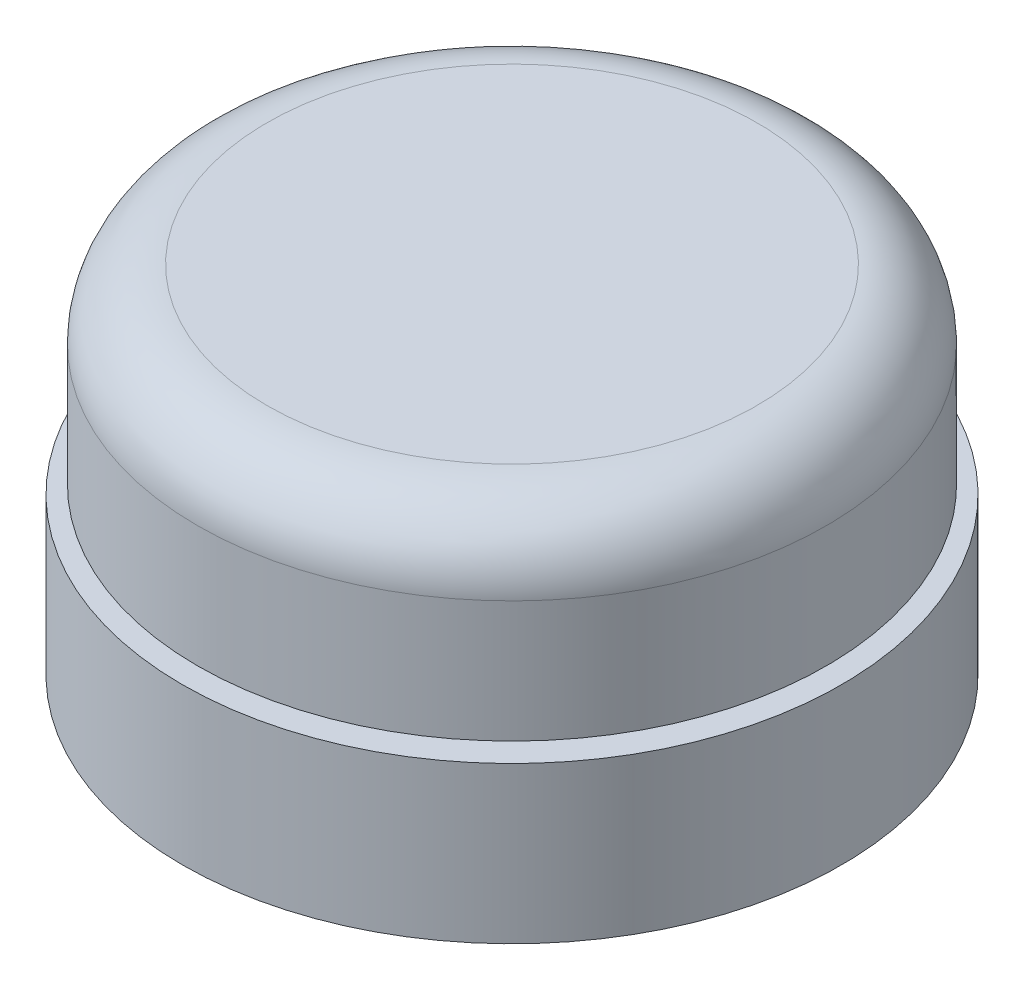
ISO-10303-21;
HEADER;
FILE_DESCRIPTION(('STEP AP214'),'2;1');
FILE_NAME('part.step','',(''),(''),'','','');
FILE_SCHEMA(('AUTOMOTIVE_DESIGN { 1 0 10303 214 1 1 1 1 }'));
ENDSEC;
DATA;
#1=APPLICATION_CONTEXT('core data for automotive mechanical design processes');
#2=APPLICATION_PROTOCOL_DEFINITION('international standard','automotive_design',2000,#1);
#3=PRODUCT_CONTEXT('',#1,'mechanical');
#4=PRODUCT('Part','Part','',(#3));
#5=PRODUCT_RELATED_PRODUCT_CATEGORY('part','',(#4));
#6=PRODUCT_DEFINITION_FORMATION('','',#4);
#7=PRODUCT_DEFINITION_CONTEXT('part definition',#1,'design');
#8=PRODUCT_DEFINITION('design','',#6,#7);
#9=PRODUCT_DEFINITION_SHAPE('','',#8);
#10=(LENGTH_UNIT() NAMED_UNIT(*) SI_UNIT(.MILLI.,.METRE.));
#11=(NAMED_UNIT(*) PLANE_ANGLE_UNIT() SI_UNIT($,.RADIAN.));
#12=(NAMED_UNIT(*) SI_UNIT($,.STERADIAN.) SOLID_ANGLE_UNIT());
#13=UNCERTAINTY_MEASURE_WITH_UNIT(LENGTH_MEASURE(1.E-05),#10,'distance_accuracy_value','');
#14=(GEOMETRIC_REPRESENTATION_CONTEXT(3) GLOBAL_UNCERTAINTY_ASSIGNED_CONTEXT((#13)) GLOBAL_UNIT_ASSIGNED_CONTEXT((#10,
#11,#12)) REPRESENTATION_CONTEXT('',''));
#15=CARTESIAN_POINT('',(0.,0.,0.));
#16=DIRECTION('',(0.,0.,1.));
#17=DIRECTION('',(1.,0.,0.));
#18=AXIS2_PLACEMENT_3D('',#15,#16,#17);
#19=CARTESIAN_POINT('',(0.,18.,0.));
#20=DIRECTION('',(0.,-1.,0.));
#21=DIRECTION('',(0.,0.,-1.));
#22=AXIS2_PLACEMENT_3D('',#19,#20,#21);
#23=CYLINDRICAL_SURFACE('',#22,38.);
#24=CARTESIAN_POINT('',(0.,18.,0.));
#25=DIRECTION('',(0.,1.,0.));
#26=DIRECTION('',(0.,0.,1.));
#27=AXIS2_PLACEMENT_3D('',#24,#25,#26);
#28=CIRCLE('',#27,38.);
#29=CARTESIAN_POINT('',(0.,18.,38.));
#30=VERTEX_POINT('',#29);
#31=EDGE_CURVE('E199',#30,#30,#28,.T.);
#32=ORIENTED_EDGE('',*,*,#31,.F.);
#33=EDGE_LOOP('',(#32));
#34=FACE_BOUND('',#33,.T.);
#35=CARTESIAN_POINT('',(0.,0.,0.));
#36=DIRECTION('',(0.,1.,0.));
#37=DIRECTION('',(0.,0.,1.));
#38=AXIS2_PLACEMENT_3D('',#35,#36,#37);
#39=CIRCLE('',#38,38.);
#40=CARTESIAN_POINT('',(0.,0.,38.));
#41=VERTEX_POINT('',#40);
#42=EDGE_CURVE('E193',#41,#41,#39,.T.);
#43=ORIENTED_EDGE('',*,*,#42,.T.);
#44=EDGE_LOOP('',(#43));
#45=FACE_BOUND('',#44,.T.);
#46=ADVANCED_FACE('F38',(#34,#45),#23,.T.);
#47=CARTESIAN_POINT('',(0.,18.,0.));
#48=DIRECTION('',(0.,1.,0.));
#49=DIRECTION('',(0.,0.,1.));
#50=AXIS2_PLACEMENT_3D('',#47,#48,#49);
#51=PLANE('',#50);
#52=CARTESIAN_POINT('',(0.,18.,0.));
#53=DIRECTION('',(0.,1.,0.));
#54=DIRECTION('',(0.,0.,1.));
#55=AXIS2_PLACEMENT_3D('',#52,#53,#54);
#56=CIRCLE('',#55,28.672717561261);
#57=CARTESIAN_POINT('',(0.,18.,28.672717561261));
#58=VERTEX_POINT('',#57);
#59=EDGE_CURVE('E194',#58,#58,#56,.T.);
#60=ORIENTED_EDGE('',*,*,#59,.F.);
#61=EDGE_LOOP('',(#60));
#62=FACE_BOUND('',#61,.T.);
#63=ORIENTED_EDGE('',*,*,#31,.T.);
#64=EDGE_LOOP('',(#63));
#65=FACE_BOUND('',#64,.T.);
#66=ADVANCED_FACE('F237',(#62,#65),#51,.T.);
#67=CARTESIAN_POINT('',(0.,0.,0.));
#68=DIRECTION('',(0.,1.,0.));
#69=DIRECTION('',(0.,0.,1.));
#70=AXIS2_PLACEMENT_3D('',#67,#68,#69);
#71=PLANE('',#70);
#72=CARTESIAN_POINT('',(-34.5,0.,0.));
#73=DIRECTION('',(0.,-1.,0.));
#74=DIRECTION('',(0.,0.,-1.));
#75=AXIS2_PLACEMENT_3D('',#72,#73,#74);
#76=CIRCLE('',#75,1.5);
#77=CARTESIAN_POINT('',(-34.5,0.,-1.5));
#78=VERTEX_POINT('',#77);
#79=EDGE_CURVE('E151',#78,#78,#76,.T.);
#80=ORIENTED_EDGE('',*,*,#79,.F.);
#81=EDGE_LOOP('',(#80));
#82=FACE_BOUND('',#81,.T.);
#83=CARTESIAN_POINT('',(-20.8596500450028,0.,20.8596500450035));
#84=DIRECTION('',(0.,-1.,0.));
#85=DIRECTION('',(0.,0.,-1.));
#86=AXIS2_PLACEMENT_3D('',#83,#84,#85);
#87=CIRCLE('',#86,1.5);
#88=CARTESIAN_POINT('',(-20.8596500450028,0.,19.3596500450035));
#89=VERTEX_POINT('',#88);
#90=EDGE_CURVE('E159',#89,#89,#87,.T.);
#91=ORIENTED_EDGE('',*,*,#90,.F.);
#92=EDGE_LOOP('',(#91));
#93=FACE_BOUND('',#92,.T.);
#94=CARTESIAN_POINT('',(1.07405111177578E-13,0.,29.5));
#95=DIRECTION('',(0.,-1.,0.));
#96=DIRECTION('',(0.,0.,-1.));
#97=AXIS2_PLACEMENT_3D('',#94,#95,#96);
#98=CIRCLE('',#97,1.5);
#99=CARTESIAN_POINT('',(1.07405111177578E-13,0.,28.));
#100=VERTEX_POINT('',#99);
#101=EDGE_CURVE('E167',#100,#100,#98,.T.);
#102=ORIENTED_EDGE('',*,*,#101,.F.);
#103=EDGE_LOOP('',(#102));
#104=FACE_BOUND('',#103,.T.);
#105=CARTESIAN_POINT('',(20.8596500450033,0.,20.859650045003));
#106=DIRECTION('',(0.,-1.,0.));
#107=DIRECTION('',(0.,0.,-1.));
#108=AXIS2_PLACEMENT_3D('',#105,#106,#107);
#109=CIRCLE('',#108,1.5);
#110=CARTESIAN_POINT('',(20.8596500450033,0.,19.359650045003));
#111=VERTEX_POINT('',#110);
#112=EDGE_CURVE('E118',#111,#111,#109,.T.);
#113=ORIENTED_EDGE('',*,*,#112,.F.);
#114=EDGE_LOOP('',(#113));
#115=FACE_BOUND('',#114,.T.);
#116=CARTESIAN_POINT('',(29.5,0.,-2.03059791203941E-13));
#117=DIRECTION('',(0.,-1.,0.));
#118=DIRECTION('',(0.,0.,-1.));
#119=AXIS2_PLACEMENT_3D('',#116,#117,#118);
#120=CIRCLE('',#119,1.5);
#121=CARTESIAN_POINT('',(29.5,0.,-1.5000000000002));
#122=VERTEX_POINT('',#121);
#123=EDGE_CURVE('E119',#122,#122,#120,.T.);
#124=ORIENTED_EDGE('',*,*,#123,.F.);
#125=EDGE_LOOP('',(#124));
#126=FACE_BOUND('',#125,.T.);
#127=CARTESIAN_POINT('',(20.859650045003,0.,-20.8596500450033));
#128=DIRECTION('',(0.,-1.,0.));
#129=DIRECTION('',(0.,0.,-1.));
#130=AXIS2_PLACEMENT_3D('',#127,#128,#129);
#131=CIRCLE('',#130,1.5);
#132=CARTESIAN_POINT('',(20.859650045003,0.,-22.3596500450033));
#133=VERTEX_POINT('',#132);
#134=EDGE_CURVE('E127',#133,#133,#131,.T.);
#135=ORIENTED_EDGE('',*,*,#134,.F.);
#136=EDGE_LOOP('',(#135));
#137=FACE_BOUND('',#136,.T.);
#138=CARTESIAN_POINT('',(-3.04589686805912E-13,0.,-29.5));
#139=DIRECTION('',(0.,-1.,0.));
#140=DIRECTION('',(0.,0.,-1.));
#141=AXIS2_PLACEMENT_3D('',#138,#139,#140);
#142=CIRCLE('',#141,1.5);
#143=CARTESIAN_POINT('',(-3.04589686805912E-13,0.,-31.));
#144=VERTEX_POINT('',#143);
#145=EDGE_CURVE('E135',#144,#144,#142,.T.);
#146=ORIENTED_EDGE('',*,*,#145,.F.);
#147=EDGE_LOOP('',(#146));
#148=FACE_BOUND('',#147,.T.);
#149=CARTESIAN_POINT('',(-20.8596500450034,0.,-20.8596500450029));
#150=DIRECTION('',(0.,-1.,0.));
#151=DIRECTION('',(0.,0.,-1.));
#152=AXIS2_PLACEMENT_3D('',#149,#150,#151);
#153=CIRCLE('',#152,1.5);
#154=CARTESIAN_POINT('',(-20.8596500450034,0.,-22.3596500450029));
#155=VERTEX_POINT('',#154);
#156=EDGE_CURVE('E108',#155,#155,#153,.T.);
#157=ORIENTED_EDGE('',*,*,#156,.F.);
#158=EDGE_LOOP('',(#157));
#159=FACE_BOUND('',#158,.T.);
#160=CARTESIAN_POINT('',(-29.5,0.,0.));
#161=DIRECTION('',(0.,-1.,0.));
#162=DIRECTION('',(0.,0.,-1.));
#163=AXIS2_PLACEMENT_3D('',#160,#161,#162);
#164=CIRCLE('',#163,1.5);
#165=CARTESIAN_POINT('',(-29.5,0.,-1.5));
#166=VERTEX_POINT('',#165);
#167=EDGE_CURVE('E150',#166,#166,#164,.T.);
#168=ORIENTED_EDGE('',*,*,#167,.F.);
#169=EDGE_LOOP('',(#168));
#170=FACE_BOUND('',#169,.T.);
#171=ORIENTED_EDGE('',*,*,#42,.F.);
#172=EDGE_LOOP('',(#171));
#173=FACE_BOUND('',#172,.T.);
#174=ADVANCED_FACE('F242',(#82,#93,#104,#115,#126,#137,#148,#159,#170,#173),#71,.F.);
#175=CARTESIAN_POINT('',(0.,19.,0.));
#176=DIRECTION('',(0.,-1.,0.));
#177=DIRECTION('',(0.,0.,-1.));
#178=AXIS2_PLACEMENT_3D('',#175,#176,#177);
#179=CYLINDRICAL_SURFACE('',#178,28.672717561261);
#180=CARTESIAN_POINT('',(0.,19.,0.));
#181=DIRECTION('',(0.,1.,0.));
#182=DIRECTION('',(0.,0.,1.));
#183=AXIS2_PLACEMENT_3D('',#180,#181,#182);
#184=CIRCLE('',#183,28.672717561261);
#185=CARTESIAN_POINT('',(0.,19.,28.672717561261));
#186=VERTEX_POINT('',#185);
#187=EDGE_CURVE('E189',#186,#186,#184,.T.);
#188=ORIENTED_EDGE('',*,*,#187,.F.);
#189=EDGE_LOOP('',(#188));
#190=FACE_BOUND('',#189,.T.);
#191=ORIENTED_EDGE('',*,*,#59,.T.);
#192=EDGE_LOOP('',(#191));
#193=FACE_BOUND('',#192,.T.);
#194=ADVANCED_FACE('F249',(#190,#193),#179,.T.);
#195=CARTESIAN_POINT('',(0.,41.,0.));
#196=DIRECTION('',(0.,-1.,0.));
#197=DIRECTION('',(0.,0.,-1.));
#198=AXIS2_PLACEMENT_3D('',#195,#196,#197);
#199=CYLINDRICAL_SURFACE('',#198,36.25);
#200=CARTESIAN_POINT('',(0.,21.,0.));
#201=DIRECTION('',(0.,-1.,0.));
#202=DIRECTION('',(0.,0.,-1.));
#203=AXIS2_PLACEMENT_3D('',#200,#201,#202);
#204=CIRCLE('',#203,36.25);
#205=CARTESIAN_POINT('',(-27.167305718455,21.,24.));
#206=VERTEX_POINT('',#205);
#207=CARTESIAN_POINT('',(-27.167305718455,21.,-24.));
#208=VERTEX_POINT('',#207);
#209=EDGE_CURVE('E47',#206,#208,#204,.T.);
#210=ORIENTED_EDGE('',*,*,#209,.T.);
#211=DIRECTION('',(0.,-1.,0.));
#212=VECTOR('',#211,1.);
#213=CARTESIAN_POINT('',(-27.167305718455,41.,-24.));
#214=LINE('',#213,#212);
#215=CARTESIAN_POINT('',(-27.167305718455,31.,-24.));
#216=VERTEX_POINT('',#215);
#217=EDGE_CURVE('E11',#208,#216,#214,.F.);
#218=ORIENTED_EDGE('',*,*,#217,.T.);
#219=CARTESIAN_POINT('',(0.,31.,0.));
#220=DIRECTION('',(0.,1.,0.));
#221=DIRECTION('',(0.,0.,1.));
#222=AXIS2_PLACEMENT_3D('',#219,#220,#221);
#223=CIRCLE('',#222,36.25);
#224=CARTESIAN_POINT('',(-27.167305718455,31.,24.));
#225=VERTEX_POINT('',#224);
#226=EDGE_CURVE('E81',#216,#225,#223,.T.);
#227=ORIENTED_EDGE('',*,*,#226,.T.);
#228=DIRECTION('',(0.,-1.,0.));
#229=VECTOR('',#228,1.);
#230=CARTESIAN_POINT('',(-27.167305718455,41.,24.));
#231=LINE('',#230,#229);
#232=EDGE_CURVE('E215',#225,#206,#231,.T.);
#233=ORIENTED_EDGE('',*,*,#232,.T.);
#234=EDGE_LOOP('',(#210,#218,#227,#233));
#235=FACE_BOUND('',#234,.T.);
#236=CARTESIAN_POINT('',(0.,33.,0.));
#237=DIRECTION('',(0.,1.,0.));
#238=DIRECTION('',(0.,0.,1.));
#239=AXIS2_PLACEMENT_3D('',#236,#237,#238);
#240=CIRCLE('',#239,36.25);
#241=CARTESIAN_POINT('',(0.,33.,36.25));
#242=VERTEX_POINT('',#241);
#243=EDGE_CURVE('E209',#242,#242,#240,.F.);
#244=ORIENTED_EDGE('',*,*,#243,.T.);
#245=EDGE_LOOP('',(#244));
#246=FACE_BOUND('',#245,.T.);
#247=CARTESIAN_POINT('',(0.,19.,0.));
#248=DIRECTION('',(0.,1.,0.));
#249=DIRECTION('',(0.,0.,1.));
#250=AXIS2_PLACEMENT_3D('',#247,#248,#249);
#251=CIRCLE('',#250,36.25);
#252=CARTESIAN_POINT('',(0.,19.,36.25));
#253=VERTEX_POINT('',#252);
#254=EDGE_CURVE('E182',#253,#253,#251,.T.);
#255=ORIENTED_EDGE('',*,*,#254,.T.);
#256=EDGE_LOOP('',(#255));
#257=FACE_BOUND('',#256,.T.);
#258=ADVANCED_FACE('F221',(#235,#246,#257),#199,.T.);
#259=CARTESIAN_POINT('',(0.,41.,0.));
#260=DIRECTION('',(0.,1.,0.));
#261=DIRECTION('',(0.,0.,1.));
#262=AXIS2_PLACEMENT_3D('',#259,#260,#261);
#263=PLANE('',#262);
#264=CARTESIAN_POINT('',(0.,41.,0.));
#265=DIRECTION('',(0.,1.,0.));
#266=DIRECTION('',(0.,0.,1.));
#267=AXIS2_PLACEMENT_3D('',#264,#265,#266);
#268=CIRCLE('',#267,28.25);
#269=CARTESIAN_POINT('',(0.,41.,28.25));
#270=VERTEX_POINT('',#269);
#271=EDGE_CURVE('E198',#270,#270,#268,.T.);
#272=ORIENTED_EDGE('',*,*,#271,.T.);
#273=EDGE_LOOP('',(#272));
#274=FACE_BOUND('',#273,.T.);
#275=ADVANCED_FACE('F257',(#274),#263,.T.);
#276=CARTESIAN_POINT('',(0.,19.,0.));
#277=DIRECTION('',(0.,1.,0.));
#278=DIRECTION('',(0.,0.,1.));
#279=AXIS2_PLACEMENT_3D('',#276,#277,#278);
#280=PLANE('',#279);
#281=ORIENTED_EDGE('',*,*,#187,.T.);
#282=EDGE_LOOP('',(#281));
#283=FACE_BOUND('',#282,.T.);
#284=ORIENTED_EDGE('',*,*,#254,.F.);
#285=EDGE_LOOP('',(#284));
#286=FACE_BOUND('',#285,.T.);
#287=ADVANCED_FACE('F258',(#283,#286),#280,.F.);
#288=CARTESIAN_POINT('',(0.,33.,0.));
#289=DIRECTION('',(0.,1.,0.));
#290=DIRECTION('',(0.,0.,1.));
#291=AXIS2_PLACEMENT_3D('',#288,#289,#290);
#292=TOROIDAL_SURFACE('',#291,28.25,8.);
#293=ORIENTED_EDGE('',*,*,#243,.F.);
#294=EDGE_LOOP('',(#293));
#295=FACE_BOUND('',#294,.T.);
#296=ORIENTED_EDGE('',*,*,#271,.F.);
#297=EDGE_LOOP('',(#296));
#298=FACE_BOUND('',#297,.T.);
#299=ADVANCED_FACE('F40',(#295,#298),#292,.T.);
#300=CARTESIAN_POINT('',(-29.5,5.,0.));
#301=DIRECTION('',(0.,-1.,0.));
#302=DIRECTION('',(0.,0.,-1.));
#303=AXIS2_PLACEMENT_3D('',#300,#301,#302);
#304=CYLINDRICAL_SURFACE('',#303,1.5);
#305=CARTESIAN_POINT('',(-29.5,5.,0.));
#306=DIRECTION('',(0.,-1.,0.));
#307=DIRECTION('',(0.,0.,-1.));
#308=AXIS2_PLACEMENT_3D('',#305,#306,#307);
#309=CIRCLE('',#308,1.5);
#310=CARTESIAN_POINT('',(-29.5,5.,-1.5));
#311=VERTEX_POINT('',#310);
#312=EDGE_CURVE('E178',#311,#311,#309,.T.);
#313=ORIENTED_EDGE('',*,*,#312,.F.);
#314=EDGE_LOOP('',(#313));
#315=FACE_BOUND('',#314,.T.);
#316=ORIENTED_EDGE('',*,*,#167,.T.);
#317=EDGE_LOOP('',(#316));
#318=FACE_BOUND('',#317,.T.);
#319=ADVANCED_FACE('F265',(#315,#318),#304,.F.);
#320=CARTESIAN_POINT('',(-29.5,5.,0.));
#321=DIRECTION('',(0.,-1.,0.));
#322=DIRECTION('',(0.,0.,-1.));
#323=AXIS2_PLACEMENT_3D('',#320,#321,#322);
#324=PLANE('',#323);
#325=ORIENTED_EDGE('',*,*,#312,.T.);
#326=EDGE_LOOP('',(#325));
#327=FACE_BOUND('',#326,.T.);
#328=ADVANCED_FACE('F268',(#327),#324,.T.);
#329=CARTESIAN_POINT('',(-20.8596500450034,5.,-20.8596500450029));
#330=DIRECTION('',(0.,-1.,0.));
#331=DIRECTION('',(0.,0.,-1.));
#332=AXIS2_PLACEMENT_3D('',#329,#330,#331);
#333=CYLINDRICAL_SURFACE('',#332,1.5);
#334=CARTESIAN_POINT('',(-20.8596500450034,5.,-20.8596500450029));
#335=DIRECTION('',(0.,-1.,0.));
#336=DIRECTION('',(0.,0.,-1.));
#337=AXIS2_PLACEMENT_3D('',#334,#335,#336);
#338=CIRCLE('',#337,1.5);
#339=CARTESIAN_POINT('',(-20.8596500450034,5.,-22.3596500450029));
#340=VERTEX_POINT('',#339);
#341=EDGE_CURVE('E139',#340,#340,#338,.T.);
#342=ORIENTED_EDGE('',*,*,#341,.F.);
#343=EDGE_LOOP('',(#342));
#344=FACE_BOUND('',#343,.T.);
#345=ORIENTED_EDGE('',*,*,#156,.T.);
#346=EDGE_LOOP('',(#345));
#347=FACE_BOUND('',#346,.T.);
#348=ADVANCED_FACE('F272',(#344,#347),#333,.F.);
#349=CARTESIAN_POINT('',(-20.8596500450034,5.,-20.8596500450029));
#350=DIRECTION('',(0.,-1.,0.));
#351=DIRECTION('',(0.,0.,-1.));
#352=AXIS2_PLACEMENT_3D('',#349,#350,#351);
#353=PLANE('',#352);
#354=ORIENTED_EDGE('',*,*,#341,.T.);
#355=EDGE_LOOP('',(#354));
#356=FACE_BOUND('',#355,.T.);
#357=ADVANCED_FACE('F309',(#356),#353,.T.);
#358=CARTESIAN_POINT('',(-3.04589686805912E-13,5.,-29.5));
#359=DIRECTION('',(0.,-1.,0.));
#360=DIRECTION('',(0.,0.,-1.));
#361=AXIS2_PLACEMENT_3D('',#358,#359,#360);
#362=CYLINDRICAL_SURFACE('',#361,1.5);
#363=CARTESIAN_POINT('',(-3.04589686805912E-13,5.,-29.5));
#364=DIRECTION('',(0.,-1.,0.));
#365=DIRECTION('',(0.,0.,-1.));
#366=AXIS2_PLACEMENT_3D('',#363,#364,#365);
#367=CIRCLE('',#366,1.5);
#368=CARTESIAN_POINT('',(-3.04589686805912E-13,5.,-31.));
#369=VERTEX_POINT('',#368);
#370=EDGE_CURVE('E131',#369,#369,#367,.T.);
#371=ORIENTED_EDGE('',*,*,#370,.F.);
#372=EDGE_LOOP('',(#371));
#373=FACE_BOUND('',#372,.T.);
#374=ORIENTED_EDGE('',*,*,#145,.T.);
#375=EDGE_LOOP('',(#374));
#376=FACE_BOUND('',#375,.T.);
#377=ADVANCED_FACE('F313',(#373,#376),#362,.F.);
#378=CARTESIAN_POINT('',(-3.04589686805912E-13,5.,-29.5));
#379=DIRECTION('',(0.,-1.,0.));
#380=DIRECTION('',(0.,0.,-1.));
#381=AXIS2_PLACEMENT_3D('',#378,#379,#380);
#382=PLANE('',#381);
#383=ORIENTED_EDGE('',*,*,#370,.T.);
#384=EDGE_LOOP('',(#383));
#385=FACE_BOUND('',#384,.T.);
#386=ADVANCED_FACE('F317',(#385),#382,.T.);
#387=CARTESIAN_POINT('',(20.859650045003,5.,-20.8596500450033));
#388=DIRECTION('',(0.,-1.,0.));
#389=DIRECTION('',(0.,0.,-1.));
#390=AXIS2_PLACEMENT_3D('',#387,#388,#389);
#391=CYLINDRICAL_SURFACE('',#390,1.5);
#392=CARTESIAN_POINT('',(20.859650045003,5.,-20.8596500450033));
#393=DIRECTION('',(0.,-1.,0.));
#394=DIRECTION('',(0.,0.,-1.));
#395=AXIS2_PLACEMENT_3D('',#392,#393,#394);
#396=CIRCLE('',#395,1.5);
#397=CARTESIAN_POINT('',(20.859650045003,5.,-22.3596500450033));
#398=VERTEX_POINT('',#397);
#399=EDGE_CURVE('E123',#398,#398,#396,.T.);
#400=ORIENTED_EDGE('',*,*,#399,.F.);
#401=EDGE_LOOP('',(#400));
#402=FACE_BOUND('',#401,.T.);
#403=ORIENTED_EDGE('',*,*,#134,.T.);
#404=EDGE_LOOP('',(#403));
#405=FACE_BOUND('',#404,.T.);
#406=ADVANCED_FACE('F321',(#402,#405),#391,.F.);
#407=CARTESIAN_POINT('',(20.859650045003,5.,-20.8596500450033));
#408=DIRECTION('',(0.,-1.,0.));
#409=DIRECTION('',(0.,0.,-1.));
#410=AXIS2_PLACEMENT_3D('',#407,#408,#409);
#411=PLANE('',#410);
#412=ORIENTED_EDGE('',*,*,#399,.T.);
#413=EDGE_LOOP('',(#412));
#414=FACE_BOUND('',#413,.T.);
#415=ADVANCED_FACE('F325',(#414),#411,.T.);
#416=CARTESIAN_POINT('',(29.5,5.,-2.03059791203941E-13));
#417=DIRECTION('',(0.,-1.,0.));
#418=DIRECTION('',(0.,0.,-1.));
#419=AXIS2_PLACEMENT_3D('',#416,#417,#418);
#420=CYLINDRICAL_SURFACE('',#419,1.5);
#421=CARTESIAN_POINT('',(29.5,5.,-2.03059791203941E-13));
#422=DIRECTION('',(0.,-1.,0.));
#423=DIRECTION('',(0.,0.,-1.));
#424=AXIS2_PLACEMENT_3D('',#421,#422,#423);
#425=CIRCLE('',#424,1.5);
#426=CARTESIAN_POINT('',(29.5,5.,-1.5000000000002));
#427=VERTEX_POINT('',#426);
#428=EDGE_CURVE('E114',#427,#427,#425,.T.);
#429=ORIENTED_EDGE('',*,*,#428,.F.);
#430=EDGE_LOOP('',(#429));
#431=FACE_BOUND('',#430,.T.);
#432=ORIENTED_EDGE('',*,*,#123,.T.);
#433=EDGE_LOOP('',(#432));
#434=FACE_BOUND('',#433,.T.);
#435=ADVANCED_FACE('F329',(#431,#434),#420,.F.);
#436=CARTESIAN_POINT('',(29.5,5.,-2.03059791203941E-13));
#437=DIRECTION('',(0.,-1.,0.));
#438=DIRECTION('',(0.,0.,-1.));
#439=AXIS2_PLACEMENT_3D('',#436,#437,#438);
#440=PLANE('',#439);
#441=ORIENTED_EDGE('',*,*,#428,.T.);
#442=EDGE_LOOP('',(#441));
#443=FACE_BOUND('',#442,.T.);
#444=ADVANCED_FACE('F278',(#443),#440,.T.);
#445=CARTESIAN_POINT('',(20.8596500450033,5.,20.859650045003));
#446=DIRECTION('',(0.,-1.,0.));
#447=DIRECTION('',(0.,0.,-1.));
#448=AXIS2_PLACEMENT_3D('',#445,#446,#447);
#449=CYLINDRICAL_SURFACE('',#448,1.5);
#450=CARTESIAN_POINT('',(20.8596500450033,5.,20.859650045003));
#451=DIRECTION('',(0.,-1.,0.));
#452=DIRECTION('',(0.,0.,-1.));
#453=AXIS2_PLACEMENT_3D('',#450,#451,#452);
#454=CIRCLE('',#453,1.5);
#455=CARTESIAN_POINT('',(20.8596500450033,5.,19.359650045003));
#456=VERTEX_POINT('',#455);
#457=EDGE_CURVE('E171',#456,#456,#454,.T.);
#458=ORIENTED_EDGE('',*,*,#457,.F.);
#459=EDGE_LOOP('',(#458));
#460=FACE_BOUND('',#459,.T.);
#461=ORIENTED_EDGE('',*,*,#112,.T.);
#462=EDGE_LOOP('',(#461));
#463=FACE_BOUND('',#462,.T.);
#464=ADVANCED_FACE('F274',(#460,#463),#449,.F.);
#465=CARTESIAN_POINT('',(20.8596500450033,5.,20.859650045003));
#466=DIRECTION('',(0.,-1.,0.));
#467=DIRECTION('',(0.,0.,-1.));
#468=AXIS2_PLACEMENT_3D('',#465,#466,#467);
#469=PLANE('',#468);
#470=ORIENTED_EDGE('',*,*,#457,.T.);
#471=EDGE_LOOP('',(#470));
#472=FACE_BOUND('',#471,.T.);
#473=ADVANCED_FACE('F277',(#472),#469,.T.);
#474=CARTESIAN_POINT('',(1.07405111177578E-13,5.,29.5));
#475=DIRECTION('',(0.,-1.,0.));
#476=DIRECTION('',(0.,0.,-1.));
#477=AXIS2_PLACEMENT_3D('',#474,#475,#476);
#478=CYLINDRICAL_SURFACE('',#477,1.5);
#479=CARTESIAN_POINT('',(1.07405111177578E-13,5.,29.5));
#480=DIRECTION('',(0.,-1.,0.));
#481=DIRECTION('',(0.,0.,-1.));
#482=AXIS2_PLACEMENT_3D('',#479,#480,#481);
#483=CIRCLE('',#482,1.5);
#484=CARTESIAN_POINT('',(1.07405111177578E-13,5.,28.));
#485=VERTEX_POINT('',#484);
#486=EDGE_CURVE('E163',#485,#485,#483,.T.);
#487=ORIENTED_EDGE('',*,*,#486,.F.);
#488=EDGE_LOOP('',(#487));
#489=FACE_BOUND('',#488,.T.);
#490=ORIENTED_EDGE('',*,*,#101,.T.);
#491=EDGE_LOOP('',(#490));
#492=FACE_BOUND('',#491,.T.);
#493=ADVANCED_FACE('F282',(#489,#492),#478,.F.);
#494=CARTESIAN_POINT('',(1.07405111177578E-13,5.,29.5));
#495=DIRECTION('',(0.,-1.,0.));
#496=DIRECTION('',(0.,0.,-1.));
#497=AXIS2_PLACEMENT_3D('',#494,#495,#496);
#498=PLANE('',#497);
#499=ORIENTED_EDGE('',*,*,#486,.T.);
#500=EDGE_LOOP('',(#499));
#501=FACE_BOUND('',#500,.T.);
#502=ADVANCED_FACE('F286',(#501),#498,.T.);
#503=CARTESIAN_POINT('',(-20.8596500450028,5.,20.8596500450035));
#504=DIRECTION('',(0.,-1.,0.));
#505=DIRECTION('',(0.,0.,-1.));
#506=AXIS2_PLACEMENT_3D('',#503,#504,#505);
#507=CYLINDRICAL_SURFACE('',#506,1.5);
#508=CARTESIAN_POINT('',(-20.8596500450028,5.,20.8596500450035));
#509=DIRECTION('',(0.,-1.,0.));
#510=DIRECTION('',(0.,0.,-1.));
#511=AXIS2_PLACEMENT_3D('',#508,#509,#510);
#512=CIRCLE('',#511,1.5);
#513=CARTESIAN_POINT('',(-20.8596500450028,5.,19.3596500450035));
#514=VERTEX_POINT('',#513);
#515=EDGE_CURVE('E155',#514,#514,#512,.T.);
#516=ORIENTED_EDGE('',*,*,#515,.F.);
#517=EDGE_LOOP('',(#516));
#518=FACE_BOUND('',#517,.T.);
#519=ORIENTED_EDGE('',*,*,#90,.T.);
#520=EDGE_LOOP('',(#519));
#521=FACE_BOUND('',#520,.T.);
#522=ADVANCED_FACE('F290',(#518,#521),#507,.F.);
#523=CARTESIAN_POINT('',(-20.8596500450028,5.,20.8596500450035));
#524=DIRECTION('',(0.,-1.,0.));
#525=DIRECTION('',(0.,0.,-1.));
#526=AXIS2_PLACEMENT_3D('',#523,#524,#525);
#527=PLANE('',#526);
#528=ORIENTED_EDGE('',*,*,#515,.T.);
#529=EDGE_LOOP('',(#528));
#530=FACE_BOUND('',#529,.T.);
#531=ADVANCED_FACE('F294',(#530),#527,.T.);
#532=CARTESIAN_POINT('',(-34.5,5.,0.));
#533=DIRECTION('',(0.,-1.,0.));
#534=DIRECTION('',(0.,0.,-1.));
#535=AXIS2_PLACEMENT_3D('',#532,#533,#534);
#536=CYLINDRICAL_SURFACE('',#535,1.5);
#537=CARTESIAN_POINT('',(-34.5,5.,0.));
#538=DIRECTION('',(0.,-1.,0.));
#539=DIRECTION('',(0.,0.,-1.));
#540=AXIS2_PLACEMENT_3D('',#537,#538,#539);
#541=CIRCLE('',#540,1.5);
#542=CARTESIAN_POINT('',(-34.5,5.,-1.5));
#543=VERTEX_POINT('',#542);
#544=EDGE_CURVE('E146',#543,#543,#541,.T.);
#545=ORIENTED_EDGE('',*,*,#544,.F.);
#546=EDGE_LOOP('',(#545));
#547=FACE_BOUND('',#546,.T.);
#548=ORIENTED_EDGE('',*,*,#79,.T.);
#549=EDGE_LOOP('',(#548));
#550=FACE_BOUND('',#549,.T.);
#551=ADVANCED_FACE('F298',(#547,#550),#536,.F.);
#552=CARTESIAN_POINT('',(-34.5,5.,0.));
#553=DIRECTION('',(0.,-1.,0.));
#554=DIRECTION('',(0.,0.,-1.));
#555=AXIS2_PLACEMENT_3D('',#552,#553,#554);
#556=PLANE('',#555);
#557=ORIENTED_EDGE('',*,*,#544,.T.);
#558=EDGE_LOOP('',(#557));
#559=FACE_BOUND('',#558,.T.);
#560=ADVANCED_FACE('F302',(#559),#556,.T.);
#561=CARTESIAN_POINT('',(-120.,31.,-24.));
#562=DIRECTION('',(0.,0.,-1.));
#563=DIRECTION('',(0.,1.,0.));
#564=AXIS2_PLACEMENT_3D('',#561,#562,#563);
#565=PLANE('',#564);
#566=DIRECTION('',(1.,0.,0.));
#567=VECTOR('',#566,1.);
#568=CARTESIAN_POINT('',(-120.,21.,-24.));
#569=LINE('',#568,#567);
#570=CARTESIAN_POINT('',(-20.,21.,-24.));
#571=VERTEX_POINT('',#570);
#572=EDGE_CURVE('E98',#208,#571,#569,.T.);
#573=ORIENTED_EDGE('',*,*,#572,.T.);
#574=DIRECTION('',(0.,1.,0.));
#575=VECTOR('',#574,1.);
#576=CARTESIAN_POINT('',(-20.,31.,-24.));
#577=LINE('',#576,#575);
#578=CARTESIAN_POINT('',(-20.,31.,-24.));
#579=VERTEX_POINT('',#578);
#580=EDGE_CURVE('E91',#571,#579,#577,.T.);
#581=ORIENTED_EDGE('',*,*,#580,.T.);
#582=DIRECTION('',(1.,0.,0.));
#583=VECTOR('',#582,1.);
#584=CARTESIAN_POINT('',(-120.,31.,-24.));
#585=LINE('',#584,#583);
#586=EDGE_CURVE('E76',#216,#579,#585,.T.);
#587=ORIENTED_EDGE('',*,*,#586,.F.);
#588=ORIENTED_EDGE('',*,*,#217,.F.);
#589=EDGE_LOOP('',(#573,#581,#587,#588));
#590=FACE_BOUND('',#589,.T.);
#591=ADVANCED_FACE('F97',(#590),#565,.F.);
#592=CARTESIAN_POINT('',(-120.,21.,-24.));
#593=DIRECTION('',(0.,-1.,0.));
#594=DIRECTION('',(0.,0.,-1.));
#595=AXIS2_PLACEMENT_3D('',#592,#593,#594);
#596=PLANE('',#595);
#597=DIRECTION('',(1.,0.,0.));
#598=VECTOR('',#597,1.);
#599=CARTESIAN_POINT('',(-120.,21.,24.));
#600=LINE('',#599,#598);
#601=CARTESIAN_POINT('',(-20.,21.,24.));
#602=VERTEX_POINT('',#601);
#603=EDGE_CURVE('E109',#206,#602,#600,.T.);
#604=ORIENTED_EDGE('',*,*,#603,.T.);
#605=DIRECTION('',(0.,0.,-1.));
#606=VECTOR('',#605,1.);
#607=CARTESIAN_POINT('',(-20.,21.,-24.));
#608=LINE('',#607,#606);
#609=EDGE_CURVE('E84',#602,#571,#608,.T.);
#610=ORIENTED_EDGE('',*,*,#609,.T.);
#611=ORIENTED_EDGE('',*,*,#572,.F.);
#612=ORIENTED_EDGE('',*,*,#209,.F.);
#613=EDGE_LOOP('',(#604,#610,#611,#612));
#614=FACE_BOUND('',#613,.T.);
#615=ADVANCED_FACE('F225',(#614),#596,.F.);
#616=CARTESIAN_POINT('',(-120.,31.,24.));
#617=DIRECTION('',(0.,0.,1.));
#618=DIRECTION('',(1.,0.,0.));
#619=AXIS2_PLACEMENT_3D('',#616,#617,#618);
#620=PLANE('',#619);
#621=DIRECTION('',(1.,0.,0.));
#622=VECTOR('',#621,1.);
#623=CARTESIAN_POINT('',(-120.,31.,24.));
#624=LINE('',#623,#622);
#625=CARTESIAN_POINT('',(-20.,31.,24.));
#626=VERTEX_POINT('',#625);
#627=EDGE_CURVE('E54',#225,#626,#624,.T.);
#628=ORIENTED_EDGE('',*,*,#627,.T.);
#629=DIRECTION('',(0.,-1.,0.));
#630=VECTOR('',#629,1.);
#631=CARTESIAN_POINT('',(-20.,31.,24.));
#632=LINE('',#631,#630);
#633=EDGE_CURVE('E94',#626,#602,#632,.T.);
#634=ORIENTED_EDGE('',*,*,#633,.T.);
#635=ORIENTED_EDGE('',*,*,#603,.F.);
#636=ORIENTED_EDGE('',*,*,#232,.F.);
#637=EDGE_LOOP('',(#628,#634,#635,#636));
#638=FACE_BOUND('',#637,.T.);
#639=ADVANCED_FACE('F227',(#638),#620,.F.);
#640=CARTESIAN_POINT('',(-120.,31.,-24.));
#641=DIRECTION('',(0.,1.,0.));
#642=DIRECTION('',(0.,0.,1.));
#643=AXIS2_PLACEMENT_3D('',#640,#641,#642);
#644=PLANE('',#643);
#645=ORIENTED_EDGE('',*,*,#586,.T.);
#646=DIRECTION('',(0.,0.,1.));
#647=VECTOR('',#646,1.);
#648=CARTESIAN_POINT('',(-20.,31.,-24.));
#649=LINE('',#648,#647);
#650=EDGE_CURVE('E79',#579,#626,#649,.T.);
#651=ORIENTED_EDGE('',*,*,#650,.T.);
#652=ORIENTED_EDGE('',*,*,#627,.F.);
#653=ORIENTED_EDGE('',*,*,#226,.F.);
#654=EDGE_LOOP('',(#645,#651,#652,#653));
#655=FACE_BOUND('',#654,.T.);
#656=ADVANCED_FACE('F78',(#655),#644,.F.);
#657=CARTESIAN_POINT('',(-20.,0.,0.));
#658=DIRECTION('',(-1.,0.,0.));
#659=DIRECTION('',(0.,0.,1.));
#660=AXIS2_PLACEMENT_3D('',#657,#658,#659);
#661=PLANE('',#660);
#662=ORIENTED_EDGE('',*,*,#580,.F.);
#663=ORIENTED_EDGE('',*,*,#609,.F.);
#664=ORIENTED_EDGE('',*,*,#633,.F.);
#665=ORIENTED_EDGE('',*,*,#650,.F.);
#666=EDGE_LOOP('',(#662,#663,#664,#665));
#667=FACE_BOUND('',#666,.T.);
#668=ADVANCED_FACE('F89',(#667),#661,.T.);
#669=CLOSED_SHELL('',(#46,#66,#174,#194,#258,#275,#287,#299,#319,#328,#348,#357,#377,#386,#406,
#415,#435,#444,#464,#473,#493,#502,#522,#531,#551,#560,#591,#615,#639,#656,#668));
#670=MANIFOLD_SOLID_BREP('B2',#669);
#671=ADVANCED_BREP_SHAPE_REPRESENTATION('',(#18,#670),#14);
#672=SHAPE_DEFINITION_REPRESENTATION(#9,#671);
ENDSEC;
END-ISO-10303-21;
